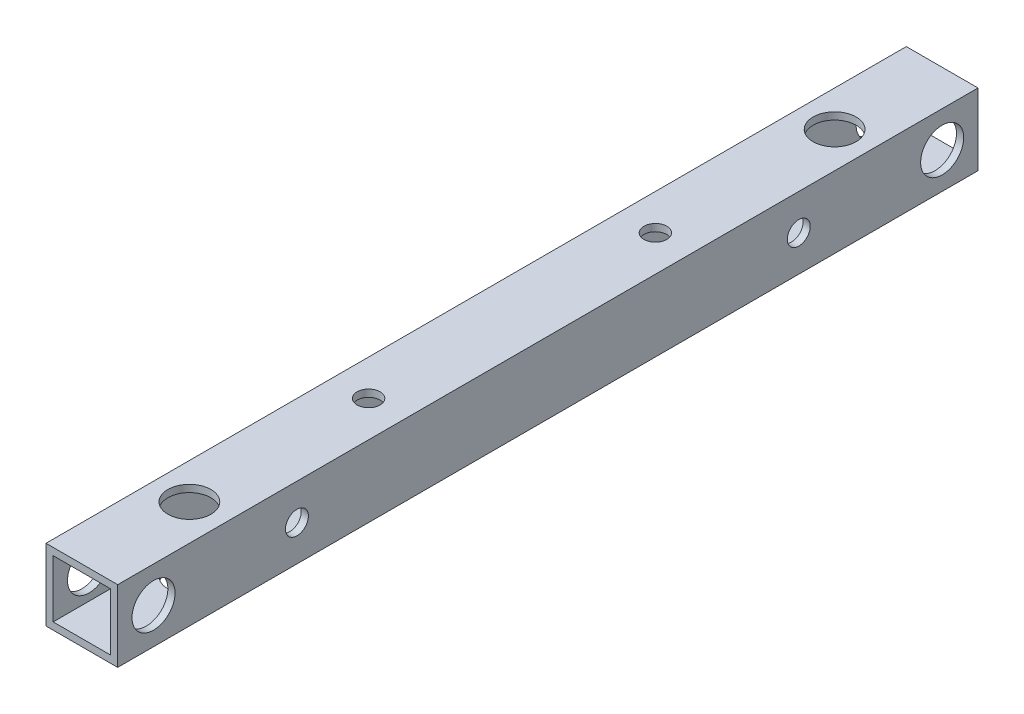
ISO-10303-21;
HEADER;
FILE_DESCRIPTION(('STEP AP214'),'2;1');
FILE_NAME('part.step','',(''),(''),'','','');
FILE_SCHEMA(('AUTOMOTIVE_DESIGN { 1 0 10303 214 1 1 1 1 }'));
ENDSEC;
DATA;
#1=APPLICATION_CONTEXT('core data for automotive mechanical design processes');
#2=APPLICATION_PROTOCOL_DEFINITION('international standard','automotive_design',2000,#1);
#3=PRODUCT_CONTEXT('',#1,'mechanical');
#4=PRODUCT('Part','Part','',(#3));
#5=PRODUCT_RELATED_PRODUCT_CATEGORY('part','',(#4));
#6=PRODUCT_DEFINITION_FORMATION('','',#4);
#7=PRODUCT_DEFINITION_CONTEXT('part definition',#1,'design');
#8=PRODUCT_DEFINITION('design','',#6,#7);
#9=PRODUCT_DEFINITION_SHAPE('','',#8);
#10=(LENGTH_UNIT() NAMED_UNIT(*) SI_UNIT(.MILLI.,.METRE.));
#11=(NAMED_UNIT(*) PLANE_ANGLE_UNIT() SI_UNIT($,.RADIAN.));
#12=(NAMED_UNIT(*) SI_UNIT($,.STERADIAN.) SOLID_ANGLE_UNIT());
#13=UNCERTAINTY_MEASURE_WITH_UNIT(LENGTH_MEASURE(1.E-05),#10,'distance_accuracy_value','');
#14=(GEOMETRIC_REPRESENTATION_CONTEXT(3) GLOBAL_UNCERTAINTY_ASSIGNED_CONTEXT((#13)) GLOBAL_UNIT_ASSIGNED_CONTEXT((#10,
#11,#12)) REPRESENTATION_CONTEXT('',''));
#15=CARTESIAN_POINT('',(0.,0.,0.));
#16=DIRECTION('',(0.,0.,1.));
#17=DIRECTION('',(1.,0.,0.));
#18=AXIS2_PLACEMENT_3D('',#15,#16,#17);
#19=CARTESIAN_POINT('',(0.,0.,120.));
#20=DIRECTION('',(0.,0.,-1.));
#21=DIRECTION('',(-1.,0.,0.));
#22=AXIS2_PLACEMENT_3D('',#19,#20,#21);
#23=PLANE('',#22);
#24=DIRECTION('',(0.,1.,0.));
#25=VECTOR('',#24,1.);
#26=CARTESIAN_POINT('',(5.,-5.,120.));
#27=LINE('',#26,#25);
#28=CARTESIAN_POINT('',(5.,-5.,120.));
#29=VERTEX_POINT('',#28);
#30=CARTESIAN_POINT('',(5.,5.,120.));
#31=VERTEX_POINT('',#30);
#32=EDGE_CURVE('E140',#29,#31,#27,.T.);
#33=ORIENTED_EDGE('',*,*,#32,.T.);
#34=DIRECTION('',(-1.,0.,0.));
#35=VECTOR('',#34,1.);
#36=CARTESIAN_POINT('',(-5.,5.,120.));
#37=LINE('',#36,#35);
#38=CARTESIAN_POINT('',(-5.,5.,120.));
#39=VERTEX_POINT('',#38);
#40=EDGE_CURVE('E143',#31,#39,#37,.T.);
#41=ORIENTED_EDGE('',*,*,#40,.T.);
#42=DIRECTION('',(0.,-1.,0.));
#43=VECTOR('',#42,1.);
#44=CARTESIAN_POINT('',(-5.,-5.,120.));
#45=LINE('',#44,#43);
#46=CARTESIAN_POINT('',(-5.,-5.,120.));
#47=VERTEX_POINT('',#46);
#48=EDGE_CURVE('E146',#39,#47,#45,.T.);
#49=ORIENTED_EDGE('',*,*,#48,.T.);
#50=DIRECTION('',(1.,0.,0.));
#51=VECTOR('',#50,1.);
#52=CARTESIAN_POINT('',(-5.,-5.,120.));
#53=LINE('',#52,#51);
#54=EDGE_CURVE('E148',#47,#29,#53,.T.);
#55=ORIENTED_EDGE('',*,*,#54,.T.);
#56=EDGE_LOOP('',(#33,#41,#49,#55));
#57=FACE_BOUND('',#56,.T.);
#58=DIRECTION('',(0.,-1.,0.));
#59=VECTOR('',#58,1.);
#60=CARTESIAN_POINT('',(-4.,-4.,120.));
#61=LINE('',#60,#59);
#62=CARTESIAN_POINT('',(-4.,4.,120.));
#63=VERTEX_POINT('',#62);
#64=CARTESIAN_POINT('',(-4.,-4.,120.));
#65=VERTEX_POINT('',#64);
#66=EDGE_CURVE('E102',#63,#65,#61,.T.);
#67=ORIENTED_EDGE('',*,*,#66,.F.);
#68=DIRECTION('',(-1.,0.,0.));
#69=VECTOR('',#68,1.);
#70=CARTESIAN_POINT('',(4.,4.,120.));
#71=LINE('',#70,#69);
#72=CARTESIAN_POINT('',(4.,4.,120.));
#73=VERTEX_POINT('',#72);
#74=EDGE_CURVE('E124',#73,#63,#71,.T.);
#75=ORIENTED_EDGE('',*,*,#74,.F.);
#76=DIRECTION('',(0.,1.,0.));
#77=VECTOR('',#76,1.);
#78=CARTESIAN_POINT('',(4.,-4.,120.));
#79=LINE('',#78,#77);
#80=CARTESIAN_POINT('',(4.,-4.,120.));
#81=VERTEX_POINT('',#80);
#82=EDGE_CURVE('E122',#81,#73,#79,.T.);
#83=ORIENTED_EDGE('',*,*,#82,.F.);
#84=DIRECTION('',(1.,0.,0.));
#85=VECTOR('',#84,1.);
#86=CARTESIAN_POINT('',(4.,-4.,120.));
#87=LINE('',#86,#85);
#88=EDGE_CURVE('E110',#65,#81,#87,.T.);
#89=ORIENTED_EDGE('',*,*,#88,.F.);
#90=EDGE_LOOP('',(#67,#75,#83,#89));
#91=FACE_BOUND('',#90,.T.);
#92=ADVANCED_FACE('F35',(#57,#91),#23,.F.);
#93=CARTESIAN_POINT('',(0.,0.,0.));
#94=DIRECTION('',(0.,0.,-1.));
#95=DIRECTION('',(-1.,0.,0.));
#96=AXIS2_PLACEMENT_3D('',#93,#94,#95);
#97=PLANE('',#96);
#98=DIRECTION('',(0.,1.,0.));
#99=VECTOR('',#98,1.);
#100=CARTESIAN_POINT('',(5.,-5.,0.));
#101=LINE('',#100,#99);
#102=CARTESIAN_POINT('',(5.,-5.,0.));
#103=VERTEX_POINT('',#102);
#104=CARTESIAN_POINT('',(5.,5.,0.));
#105=VERTEX_POINT('',#104);
#106=EDGE_CURVE('E118',#103,#105,#101,.T.);
#107=ORIENTED_EDGE('',*,*,#106,.F.);
#108=DIRECTION('',(1.,0.,0.));
#109=VECTOR('',#108,1.);
#110=CARTESIAN_POINT('',(-5.,-5.,0.));
#111=LINE('',#110,#109);
#112=CARTESIAN_POINT('',(-5.,-5.,0.));
#113=VERTEX_POINT('',#112);
#114=EDGE_CURVE('E144',#113,#103,#111,.T.);
#115=ORIENTED_EDGE('',*,*,#114,.F.);
#116=DIRECTION('',(0.,-1.,0.));
#117=VECTOR('',#116,1.);
#118=CARTESIAN_POINT('',(-5.,-5.,0.));
#119=LINE('',#118,#117);
#120=CARTESIAN_POINT('',(-5.,5.,0.));
#121=VERTEX_POINT('',#120);
#122=EDGE_CURVE('E155',#121,#113,#119,.T.);
#123=ORIENTED_EDGE('',*,*,#122,.F.);
#124=DIRECTION('',(-1.,0.,0.));
#125=VECTOR('',#124,1.);
#126=CARTESIAN_POINT('',(-5.,5.,0.));
#127=LINE('',#126,#125);
#128=EDGE_CURVE('E153',#105,#121,#127,.T.);
#129=ORIENTED_EDGE('',*,*,#128,.F.);
#130=EDGE_LOOP('',(#107,#115,#123,#129));
#131=FACE_BOUND('',#130,.T.);
#132=DIRECTION('',(-1.,0.,0.));
#133=VECTOR('',#132,1.);
#134=CARTESIAN_POINT('',(4.,4.,0.));
#135=LINE('',#134,#133);
#136=CARTESIAN_POINT('',(4.,4.,0.));
#137=VERTEX_POINT('',#136);
#138=CARTESIAN_POINT('',(-4.,4.,0.));
#139=VERTEX_POINT('',#138);
#140=EDGE_CURVE('E111',#137,#139,#135,.T.);
#141=ORIENTED_EDGE('',*,*,#140,.T.);
#142=DIRECTION('',(0.,-1.,0.));
#143=VECTOR('',#142,1.);
#144=CARTESIAN_POINT('',(-4.,-4.,0.));
#145=LINE('',#144,#143);
#146=CARTESIAN_POINT('',(-4.,-4.,0.));
#147=VERTEX_POINT('',#146);
#148=EDGE_CURVE('E60',#139,#147,#145,.T.);
#149=ORIENTED_EDGE('',*,*,#148,.T.);
#150=DIRECTION('',(1.,0.,0.));
#151=VECTOR('',#150,1.);
#152=CARTESIAN_POINT('',(4.,-4.,0.));
#153=LINE('',#152,#151);
#154=CARTESIAN_POINT('',(4.,-4.,0.));
#155=VERTEX_POINT('',#154);
#156=EDGE_CURVE('E117',#147,#155,#153,.T.);
#157=ORIENTED_EDGE('',*,*,#156,.T.);
#158=DIRECTION('',(0.,1.,0.));
#159=VECTOR('',#158,1.);
#160=CARTESIAN_POINT('',(4.,-4.,0.));
#161=LINE('',#160,#159);
#162=EDGE_CURVE('E132',#155,#137,#161,.T.);
#163=ORIENTED_EDGE('',*,*,#162,.T.);
#164=EDGE_LOOP('',(#141,#149,#157,#163));
#165=FACE_BOUND('',#164,.T.);
#166=ADVANCED_FACE('F295',(#131,#165),#97,.T.);
#167=CARTESIAN_POINT('',(5.,-5.,120.));
#168=DIRECTION('',(-1.,0.,0.));
#169=DIRECTION('',(0.,0.,1.));
#170=AXIS2_PLACEMENT_3D('',#167,#168,#169);
#171=PLANE('',#170);
#172=CARTESIAN_POINT('',(5.,0.,25.));
#173=DIRECTION('',(-1.,0.,0.));
#174=DIRECTION('',(0.,0.,1.));
#175=AXIS2_PLACEMENT_3D('',#172,#173,#174);
#176=CIRCLE('',#175,1.60000000000001);
#177=CARTESIAN_POINT('',(5.,0.,26.6));
#178=VERTEX_POINT('',#177);
#179=EDGE_CURVE('E194',#178,#178,#176,.T.);
#180=ORIENTED_EDGE('',*,*,#179,.T.);
#181=EDGE_LOOP('',(#180));
#182=FACE_BOUND('',#181,.T.);
#183=CARTESIAN_POINT('',(5.,0.,95.));
#184=DIRECTION('',(-1.,0.,0.));
#185=DIRECTION('',(0.,0.,1.));
#186=AXIS2_PLACEMENT_3D('',#183,#184,#185);
#187=CIRCLE('',#186,1.60000000000001);
#188=CARTESIAN_POINT('',(5.,0.,96.6));
#189=VERTEX_POINT('',#188);
#190=EDGE_CURVE('E218',#189,#189,#187,.T.);
#191=ORIENTED_EDGE('',*,*,#190,.T.);
#192=EDGE_LOOP('',(#191));
#193=FACE_BOUND('',#192,.T.);
#194=CARTESIAN_POINT('',(5.,0.,5.));
#195=DIRECTION('',(-1.,0.,0.));
#196=DIRECTION('',(0.,0.,1.));
#197=AXIS2_PLACEMENT_3D('',#194,#195,#196);
#198=CIRCLE('',#197,3.);
#199=CARTESIAN_POINT('',(5.,0.,8.));
#200=VERTEX_POINT('',#199);
#201=EDGE_CURVE('E169',#200,#200,#198,.T.);
#202=ORIENTED_EDGE('',*,*,#201,.T.);
#203=EDGE_LOOP('',(#202));
#204=FACE_BOUND('',#203,.T.);
#205=CARTESIAN_POINT('',(5.,0.,115.));
#206=DIRECTION('',(-1.,0.,0.));
#207=DIRECTION('',(0.,0.,1.));
#208=AXIS2_PLACEMENT_3D('',#205,#206,#207);
#209=CIRCLE('',#208,3.00000000000001);
#210=CARTESIAN_POINT('',(5.,0.,118.));
#211=VERTEX_POINT('',#210);
#212=EDGE_CURVE('E252',#211,#211,#209,.T.);
#213=ORIENTED_EDGE('',*,*,#212,.T.);
#214=EDGE_LOOP('',(#213));
#215=FACE_BOUND('',#214,.T.);
#216=ORIENTED_EDGE('',*,*,#106,.T.);
#217=DIRECTION('',(0.,0.,-1.));
#218=VECTOR('',#217,1.);
#219=CARTESIAN_POINT('',(5.,5.,120.));
#220=LINE('',#219,#218);
#221=EDGE_CURVE('E11',#31,#105,#220,.T.);
#222=ORIENTED_EDGE('',*,*,#221,.F.);
#223=ORIENTED_EDGE('',*,*,#32,.F.);
#224=DIRECTION('',(0.,0.,-1.));
#225=VECTOR('',#224,1.);
#226=CARTESIAN_POINT('',(5.,-5.,120.));
#227=LINE('',#226,#225);
#228=EDGE_CURVE('E150',#29,#103,#227,.T.);
#229=ORIENTED_EDGE('',*,*,#228,.T.);
#230=EDGE_LOOP('',(#216,#222,#223,#229));
#231=FACE_BOUND('',#230,.T.);
#232=ADVANCED_FACE('F37',(#182,#193,#204,#215,#231),#171,.F.);
#233=CARTESIAN_POINT('',(-5.,5.,120.));
#234=DIRECTION('',(0.,-1.,0.));
#235=DIRECTION('',(0.,0.,-1.));
#236=AXIS2_PLACEMENT_3D('',#233,#234,#235);
#237=PLANE('',#236);
#238=CARTESIAN_POINT('',(0.,5.,40.));
#239=DIRECTION('',(0.,1.,0.));
#240=DIRECTION('',(0.,0.,1.));
#241=AXIS2_PLACEMENT_3D('',#238,#239,#240);
#242=CIRCLE('',#241,1.6);
#243=CARTESIAN_POINT('',(0.,5.,41.6));
#244=VERTEX_POINT('',#243);
#245=EDGE_CURVE('E186',#244,#244,#242,.T.);
#246=ORIENTED_EDGE('',*,*,#245,.F.);
#247=EDGE_LOOP('',(#246));
#248=FACE_BOUND('',#247,.T.);
#249=CARTESIAN_POINT('',(0.,5.,80.));
#250=DIRECTION('',(0.,1.,0.));
#251=DIRECTION('',(0.,0.,1.));
#252=AXIS2_PLACEMENT_3D('',#249,#250,#251);
#253=CIRCLE('',#252,1.6);
#254=CARTESIAN_POINT('',(0.,5.,81.6));
#255=VERTEX_POINT('',#254);
#256=EDGE_CURVE('E227',#255,#255,#253,.T.);
#257=ORIENTED_EDGE('',*,*,#256,.F.);
#258=EDGE_LOOP('',(#257));
#259=FACE_BOUND('',#258,.T.);
#260=CARTESIAN_POINT('',(0.,5.,105.));
#261=DIRECTION('',(0.,1.,0.));
#262=DIRECTION('',(0.,0.,1.));
#263=AXIS2_PLACEMENT_3D('',#260,#261,#262);
#264=CIRCLE('',#263,3.);
#265=CARTESIAN_POINT('',(0.,5.,108.));
#266=VERTEX_POINT('',#265);
#267=EDGE_CURVE('E234',#266,#266,#264,.T.);
#268=ORIENTED_EDGE('',*,*,#267,.F.);
#269=EDGE_LOOP('',(#268));
#270=FACE_BOUND('',#269,.T.);
#271=CARTESIAN_POINT('',(0.,5.,15.));
#272=DIRECTION('',(0.,1.,0.));
#273=DIRECTION('',(0.,0.,1.));
#274=AXIS2_PLACEMENT_3D('',#271,#272,#273);
#275=CIRCLE('',#274,3.);
#276=CARTESIAN_POINT('',(0.,5.,18.));
#277=VERTEX_POINT('',#276);
#278=EDGE_CURVE('E189',#277,#277,#275,.T.);
#279=ORIENTED_EDGE('',*,*,#278,.F.);
#280=EDGE_LOOP('',(#279));
#281=FACE_BOUND('',#280,.T.);
#282=ORIENTED_EDGE('',*,*,#128,.T.);
#283=DIRECTION('',(0.,0.,-1.));
#284=VECTOR('',#283,1.);
#285=CARTESIAN_POINT('',(-5.,5.,120.));
#286=LINE('',#285,#284);
#287=EDGE_CURVE('E44',#39,#121,#286,.T.);
#288=ORIENTED_EDGE('',*,*,#287,.F.);
#289=ORIENTED_EDGE('',*,*,#40,.F.);
#290=ORIENTED_EDGE('',*,*,#221,.T.);
#291=EDGE_LOOP('',(#282,#288,#289,#290));
#292=FACE_BOUND('',#291,.T.);
#293=ADVANCED_FACE('F282',(#248,#259,#270,#281,#292),#237,.F.);
#294=CARTESIAN_POINT('',(-5.,-5.,120.));
#295=DIRECTION('',(1.,0.,0.));
#296=DIRECTION('',(0.,0.,-1.));
#297=AXIS2_PLACEMENT_3D('',#294,#295,#296);
#298=PLANE('',#297);
#299=CARTESIAN_POINT('',(-5.,0.,25.));
#300=DIRECTION('',(-1.,0.,0.));
#301=DIRECTION('',(0.,0.,1.));
#302=AXIS2_PLACEMENT_3D('',#299,#300,#301);
#303=CIRCLE('',#302,1.60000000000001);
#304=CARTESIAN_POINT('',(-5.,0.,26.6));
#305=VERTEX_POINT('',#304);
#306=EDGE_CURVE('E215',#305,#305,#303,.T.);
#307=ORIENTED_EDGE('',*,*,#306,.F.);
#308=EDGE_LOOP('',(#307));
#309=FACE_BOUND('',#308,.T.);
#310=CARTESIAN_POINT('',(-5.,0.,95.));
#311=DIRECTION('',(-1.,0.,0.));
#312=DIRECTION('',(0.,0.,1.));
#313=AXIS2_PLACEMENT_3D('',#310,#311,#312);
#314=CIRCLE('',#313,1.60000000000001);
#315=CARTESIAN_POINT('',(-5.,0.,96.6));
#316=VERTEX_POINT('',#315);
#317=EDGE_CURVE('E204',#316,#316,#314,.T.);
#318=ORIENTED_EDGE('',*,*,#317,.F.);
#319=EDGE_LOOP('',(#318));
#320=FACE_BOUND('',#319,.T.);
#321=CARTESIAN_POINT('',(-5.,0.,5.));
#322=DIRECTION('',(-1.,0.,0.));
#323=DIRECTION('',(0.,0.,1.));
#324=AXIS2_PLACEMENT_3D('',#321,#322,#323);
#325=CIRCLE('',#324,3.);
#326=CARTESIAN_POINT('',(-5.,0.,8.));
#327=VERTEX_POINT('',#326);
#328=EDGE_CURVE('E249',#327,#327,#325,.T.);
#329=ORIENTED_EDGE('',*,*,#328,.F.);
#330=EDGE_LOOP('',(#329));
#331=FACE_BOUND('',#330,.T.);
#332=CARTESIAN_POINT('',(-5.,0.,115.));
#333=DIRECTION('',(-1.,0.,0.));
#334=DIRECTION('',(0.,0.,1.));
#335=AXIS2_PLACEMENT_3D('',#332,#333,#334);
#336=CIRCLE('',#335,3.00000000000001);
#337=CARTESIAN_POINT('',(-5.,0.,118.));
#338=VERTEX_POINT('',#337);
#339=EDGE_CURVE('E246',#338,#338,#336,.T.);
#340=ORIENTED_EDGE('',*,*,#339,.F.);
#341=EDGE_LOOP('',(#340));
#342=FACE_BOUND('',#341,.T.);
#343=ORIENTED_EDGE('',*,*,#122,.T.);
#344=DIRECTION('',(0.,0.,-1.));
#345=VECTOR('',#344,1.);
#346=CARTESIAN_POINT('',(-5.,-5.,120.));
#347=LINE('',#346,#345);
#348=EDGE_CURVE('E160',#47,#113,#347,.T.);
#349=ORIENTED_EDGE('',*,*,#348,.F.);
#350=ORIENTED_EDGE('',*,*,#48,.F.);
#351=ORIENTED_EDGE('',*,*,#287,.T.);
#352=EDGE_LOOP('',(#343,#349,#350,#351));
#353=FACE_BOUND('',#352,.T.);
#354=ADVANCED_FACE('F279',(#309,#320,#331,#342,#353),#298,.F.);
#355=CARTESIAN_POINT('',(-5.,-5.,120.));
#356=DIRECTION('',(0.,1.,0.));
#357=DIRECTION('',(0.,0.,1.));
#358=AXIS2_PLACEMENT_3D('',#355,#356,#357);
#359=PLANE('',#358);
#360=CARTESIAN_POINT('',(0.,-5.,40.));
#361=DIRECTION('',(0.,-1.,0.));
#362=DIRECTION('',(0.,0.,-1.));
#363=AXIS2_PLACEMENT_3D('',#360,#361,#362);
#364=CIRCLE('',#363,3.);
#365=CARTESIAN_POINT('',(0.,-5.,37.));
#366=VERTEX_POINT('',#365);
#367=EDGE_CURVE('E200',#366,#366,#364,.T.);
#368=ORIENTED_EDGE('',*,*,#367,.F.);
#369=EDGE_LOOP('',(#368));
#370=FACE_BOUND('',#369,.T.);
#371=CARTESIAN_POINT('',(0.,-5.,80.));
#372=DIRECTION('',(0.,-1.,0.));
#373=DIRECTION('',(0.,0.,-1.));
#374=AXIS2_PLACEMENT_3D('',#371,#372,#373);
#375=CIRCLE('',#374,3.);
#376=CARTESIAN_POINT('',(0.,-5.,77.));
#377=VERTEX_POINT('',#376);
#378=EDGE_CURVE('E206',#377,#377,#375,.T.);
#379=ORIENTED_EDGE('',*,*,#378,.F.);
#380=EDGE_LOOP('',(#379));
#381=FACE_BOUND('',#380,.T.);
#382=CARTESIAN_POINT('',(0.,-5.,105.));
#383=DIRECTION('',(0.,1.,0.));
#384=DIRECTION('',(0.,0.,1.));
#385=AXIS2_PLACEMENT_3D('',#382,#383,#384);
#386=CIRCLE('',#385,3.);
#387=CARTESIAN_POINT('',(0.,-5.,108.));
#388=VERTEX_POINT('',#387);
#389=EDGE_CURVE('E177',#388,#388,#386,.T.);
#390=ORIENTED_EDGE('',*,*,#389,.T.);
#391=EDGE_LOOP('',(#390));
#392=FACE_BOUND('',#391,.T.);
#393=CARTESIAN_POINT('',(0.,-5.,15.));
#394=DIRECTION('',(0.,1.,0.));
#395=DIRECTION('',(0.,0.,1.));
#396=AXIS2_PLACEMENT_3D('',#393,#394,#395);
#397=CIRCLE('',#396,3.);
#398=CARTESIAN_POINT('',(0.,-5.,18.));
#399=VERTEX_POINT('',#398);
#400=EDGE_CURVE('E237',#399,#399,#397,.T.);
#401=ORIENTED_EDGE('',*,*,#400,.T.);
#402=EDGE_LOOP('',(#401));
#403=FACE_BOUND('',#402,.T.);
#404=ORIENTED_EDGE('',*,*,#114,.T.);
#405=ORIENTED_EDGE('',*,*,#228,.F.);
#406=ORIENTED_EDGE('',*,*,#54,.F.);
#407=ORIENTED_EDGE('',*,*,#348,.T.);
#408=EDGE_LOOP('',(#404,#405,#406,#407));
#409=FACE_BOUND('',#408,.T.);
#410=ADVANCED_FACE('F266',(#370,#381,#392,#403,#409),#359,.F.);
#411=CARTESIAN_POINT('',(-4.,-4.,120.));
#412=DIRECTION('',(1.,0.,0.));
#413=DIRECTION('',(0.,1.,0.));
#414=AXIS2_PLACEMENT_3D('',#411,#412,#413);
#415=PLANE('',#414);
#416=CARTESIAN_POINT('',(-4.,0.,25.));
#417=DIRECTION('',(1.,0.,0.));
#418=DIRECTION('',(0.,1.,0.));
#419=AXIS2_PLACEMENT_3D('',#416,#417,#418);
#420=CIRCLE('',#419,1.60000000000001);
#421=CARTESIAN_POINT('',(-4.,1.60000000000001,25.));
#422=VERTEX_POINT('',#421);
#423=EDGE_CURVE('E197',#422,#422,#420,.T.);
#424=ORIENTED_EDGE('',*,*,#423,.F.);
#425=EDGE_LOOP('',(#424));
#426=FACE_BOUND('',#425,.T.);
#427=CARTESIAN_POINT('',(-4.,0.,95.));
#428=DIRECTION('',(1.,0.,0.));
#429=DIRECTION('',(0.,1.,0.));
#430=AXIS2_PLACEMENT_3D('',#427,#428,#429);
#431=CIRCLE('',#430,1.60000000000001);
#432=CARTESIAN_POINT('',(-4.,1.60000000000001,95.));
#433=VERTEX_POINT('',#432);
#434=EDGE_CURVE('E193',#433,#433,#431,.T.);
#435=ORIENTED_EDGE('',*,*,#434,.F.);
#436=EDGE_LOOP('',(#435));
#437=FACE_BOUND('',#436,.T.);
#438=CARTESIAN_POINT('',(-4.,0.,5.));
#439=DIRECTION('',(1.,0.,0.));
#440=DIRECTION('',(0.,1.,0.));
#441=AXIS2_PLACEMENT_3D('',#438,#439,#440);
#442=CIRCLE('',#441,3.);
#443=CARTESIAN_POINT('',(-4.,3.,5.));
#444=VERTEX_POINT('',#443);
#445=EDGE_CURVE('E130',#444,#444,#442,.T.);
#446=ORIENTED_EDGE('',*,*,#445,.F.);
#447=EDGE_LOOP('',(#446));
#448=FACE_BOUND('',#447,.T.);
#449=CARTESIAN_POINT('',(-4.,0.,115.));
#450=DIRECTION('',(1.,0.,0.));
#451=DIRECTION('',(0.,1.,0.));
#452=AXIS2_PLACEMENT_3D('',#449,#450,#451);
#453=CIRCLE('',#452,3.00000000000001);
#454=CARTESIAN_POINT('',(-4.,3.00000000000001,115.));
#455=VERTEX_POINT('',#454);
#456=EDGE_CURVE('E168',#455,#455,#453,.T.);
#457=ORIENTED_EDGE('',*,*,#456,.F.);
#458=EDGE_LOOP('',(#457));
#459=FACE_BOUND('',#458,.T.);
#460=ORIENTED_EDGE('',*,*,#148,.F.);
#461=DIRECTION('',(0.,0.,-1.));
#462=VECTOR('',#461,1.);
#463=CARTESIAN_POINT('',(-4.,4.,120.));
#464=LINE('',#463,#462);
#465=EDGE_CURVE('E106',#63,#139,#464,.T.);
#466=ORIENTED_EDGE('',*,*,#465,.F.);
#467=ORIENTED_EDGE('',*,*,#66,.T.);
#468=DIRECTION('',(0.,0.,-1.));
#469=VECTOR('',#468,1.);
#470=CARTESIAN_POINT('',(-4.,-4.,120.));
#471=LINE('',#470,#469);
#472=EDGE_CURVE('E105',#65,#147,#471,.T.);
#473=ORIENTED_EDGE('',*,*,#472,.T.);
#474=EDGE_LOOP('',(#460,#466,#467,#473));
#475=FACE_BOUND('',#474,.T.);
#476=ADVANCED_FACE('F104',(#426,#437,#448,#459,#475),#415,.T.);
#477=CARTESIAN_POINT('',(4.,-4.,120.));
#478=DIRECTION('',(0.,1.,0.));
#479=DIRECTION('',(-1.,0.,0.));
#480=AXIS2_PLACEMENT_3D('',#477,#478,#479);
#481=PLANE('',#480);
#482=CARTESIAN_POINT('',(0.,-4.,40.));
#483=DIRECTION('',(0.,1.,0.));
#484=DIRECTION('',(-1.,0.,0.));
#485=AXIS2_PLACEMENT_3D('',#482,#483,#484);
#486=CIRCLE('',#485,3.);
#487=CARTESIAN_POINT('',(-3.,-4.,40.));
#488=VERTEX_POINT('',#487);
#489=EDGE_CURVE('E39',#488,#488,#486,.T.);
#490=ORIENTED_EDGE('',*,*,#489,.F.);
#491=EDGE_LOOP('',(#490));
#492=FACE_BOUND('',#491,.T.);
#493=CARTESIAN_POINT('',(0.,-4.,80.));
#494=DIRECTION('',(0.,1.,0.));
#495=DIRECTION('',(-1.,0.,0.));
#496=AXIS2_PLACEMENT_3D('',#493,#494,#495);
#497=CIRCLE('',#496,3.);
#498=CARTESIAN_POINT('',(-3.,-4.,80.));
#499=VERTEX_POINT('',#498);
#500=EDGE_CURVE('E198',#499,#499,#497,.T.);
#501=ORIENTED_EDGE('',*,*,#500,.F.);
#502=EDGE_LOOP('',(#501));
#503=FACE_BOUND('',#502,.T.);
#504=CARTESIAN_POINT('',(0.,-4.,105.));
#505=DIRECTION('',(0.,1.,0.));
#506=DIRECTION('',(-1.,0.,0.));
#507=AXIS2_PLACEMENT_3D('',#504,#505,#506);
#508=CIRCLE('',#507,3.);
#509=CARTESIAN_POINT('',(-3.,-4.,105.));
#510=VERTEX_POINT('',#509);
#511=EDGE_CURVE('E181',#510,#510,#508,.T.);
#512=ORIENTED_EDGE('',*,*,#511,.F.);
#513=EDGE_LOOP('',(#512));
#514=FACE_BOUND('',#513,.T.);
#515=CARTESIAN_POINT('',(0.,-4.,15.));
#516=DIRECTION('',(0.,1.,0.));
#517=DIRECTION('',(-1.,0.,0.));
#518=AXIS2_PLACEMENT_3D('',#515,#516,#517);
#519=CIRCLE('',#518,3.);
#520=CARTESIAN_POINT('',(-3.,-4.,15.));
#521=VERTEX_POINT('',#520);
#522=EDGE_CURVE('E176',#521,#521,#519,.T.);
#523=ORIENTED_EDGE('',*,*,#522,.F.);
#524=EDGE_LOOP('',(#523));
#525=FACE_BOUND('',#524,.T.);
#526=ORIENTED_EDGE('',*,*,#156,.F.);
#527=ORIENTED_EDGE('',*,*,#472,.F.);
#528=ORIENTED_EDGE('',*,*,#88,.T.);
#529=DIRECTION('',(0.,0.,-1.));
#530=VECTOR('',#529,1.);
#531=CARTESIAN_POINT('',(4.,-4.,120.));
#532=LINE('',#531,#530);
#533=EDGE_CURVE('E119',#81,#155,#532,.T.);
#534=ORIENTED_EDGE('',*,*,#533,.T.);
#535=EDGE_LOOP('',(#526,#527,#528,#534));
#536=FACE_BOUND('',#535,.T.);
#537=ADVANCED_FACE('F114',(#492,#503,#514,#525,#536),#481,.T.);
#538=CARTESIAN_POINT('',(4.,-4.,120.));
#539=DIRECTION('',(-1.,0.,0.));
#540=DIRECTION('',(0.,0.,1.));
#541=AXIS2_PLACEMENT_3D('',#538,#539,#540);
#542=PLANE('',#541);
#543=CARTESIAN_POINT('',(4.,0.,25.));
#544=DIRECTION('',(-1.,0.,0.));
#545=DIRECTION('',(0.,0.,1.));
#546=AXIS2_PLACEMENT_3D('',#543,#544,#545);
#547=CIRCLE('',#546,1.60000000000001);
#548=CARTESIAN_POINT('',(4.,0.,26.6));
#549=VERTEX_POINT('',#548);
#550=EDGE_CURVE('E195',#549,#549,#547,.T.);
#551=ORIENTED_EDGE('',*,*,#550,.F.);
#552=EDGE_LOOP('',(#551));
#553=FACE_BOUND('',#552,.T.);
#554=CARTESIAN_POINT('',(4.,0.,95.));
#555=DIRECTION('',(-1.,0.,0.));
#556=DIRECTION('',(0.,0.,1.));
#557=AXIS2_PLACEMENT_3D('',#554,#555,#556);
#558=CIRCLE('',#557,1.60000000000001);
#559=CARTESIAN_POINT('',(4.,0.,96.6));
#560=VERTEX_POINT('',#559);
#561=EDGE_CURVE('E190',#560,#560,#558,.T.);
#562=ORIENTED_EDGE('',*,*,#561,.F.);
#563=EDGE_LOOP('',(#562));
#564=FACE_BOUND('',#563,.T.);
#565=CARTESIAN_POINT('',(4.,0.,5.));
#566=DIRECTION('',(-1.,0.,0.));
#567=DIRECTION('',(0.,0.,1.));
#568=AXIS2_PLACEMENT_3D('',#565,#566,#567);
#569=CIRCLE('',#568,3.);
#570=CARTESIAN_POINT('',(4.,0.,8.));
#571=VERTEX_POINT('',#570);
#572=EDGE_CURVE('E170',#571,#571,#569,.T.);
#573=ORIENTED_EDGE('',*,*,#572,.F.);
#574=EDGE_LOOP('',(#573));
#575=FACE_BOUND('',#574,.T.);
#576=CARTESIAN_POINT('',(4.,0.,115.));
#577=DIRECTION('',(-1.,0.,0.));
#578=DIRECTION('',(0.,0.,1.));
#579=AXIS2_PLACEMENT_3D('',#576,#577,#578);
#580=CIRCLE('',#579,3.00000000000001);
#581=CARTESIAN_POINT('',(4.,0.,118.));
#582=VERTEX_POINT('',#581);
#583=EDGE_CURVE('E165',#582,#582,#580,.T.);
#584=ORIENTED_EDGE('',*,*,#583,.F.);
#585=EDGE_LOOP('',(#584));
#586=FACE_BOUND('',#585,.T.);
#587=ORIENTED_EDGE('',*,*,#162,.F.);
#588=ORIENTED_EDGE('',*,*,#533,.F.);
#589=ORIENTED_EDGE('',*,*,#82,.T.);
#590=DIRECTION('',(0.,0.,-1.));
#591=VECTOR('',#590,1.);
#592=CARTESIAN_POINT('',(4.,4.,120.));
#593=LINE('',#592,#591);
#594=EDGE_CURVE('E52',#73,#137,#593,.T.);
#595=ORIENTED_EDGE('',*,*,#594,.T.);
#596=EDGE_LOOP('',(#587,#588,#589,#595));
#597=FACE_BOUND('',#596,.T.);
#598=ADVANCED_FACE('F357',(#553,#564,#575,#586,#597),#542,.T.);
#599=CARTESIAN_POINT('',(4.,4.,120.));
#600=DIRECTION('',(0.,-1.,0.));
#601=DIRECTION('',(1.,0.,0.));
#602=AXIS2_PLACEMENT_3D('',#599,#600,#601);
#603=PLANE('',#602);
#604=CARTESIAN_POINT('',(0.,4.,40.));
#605=DIRECTION('',(0.,-1.,0.));
#606=DIRECTION('',(1.,0.,0.));
#607=AXIS2_PLACEMENT_3D('',#604,#605,#606);
#608=CIRCLE('',#607,1.6);
#609=CARTESIAN_POINT('',(1.6,4.,40.));
#610=VERTEX_POINT('',#609);
#611=EDGE_CURVE('E185',#610,#610,#608,.T.);
#612=ORIENTED_EDGE('',*,*,#611,.F.);
#613=EDGE_LOOP('',(#612));
#614=FACE_BOUND('',#613,.T.);
#615=CARTESIAN_POINT('',(0.,4.,80.));
#616=DIRECTION('',(0.,-1.,0.));
#617=DIRECTION('',(1.,0.,0.));
#618=AXIS2_PLACEMENT_3D('',#615,#616,#617);
#619=CIRCLE('',#618,1.6);
#620=CARTESIAN_POINT('',(1.6,4.,80.));
#621=VERTEX_POINT('',#620);
#622=EDGE_CURVE('E182',#621,#621,#619,.T.);
#623=ORIENTED_EDGE('',*,*,#622,.F.);
#624=EDGE_LOOP('',(#623));
#625=FACE_BOUND('',#624,.T.);
#626=CARTESIAN_POINT('',(0.,4.,105.));
#627=DIRECTION('',(0.,-1.,0.));
#628=DIRECTION('',(1.,0.,0.));
#629=AXIS2_PLACEMENT_3D('',#626,#627,#628);
#630=CIRCLE('',#629,3.);
#631=CARTESIAN_POINT('',(3.,4.,105.));
#632=VERTEX_POINT('',#631);
#633=EDGE_CURVE('E178',#632,#632,#630,.T.);
#634=ORIENTED_EDGE('',*,*,#633,.F.);
#635=EDGE_LOOP('',(#634));
#636=FACE_BOUND('',#635,.T.);
#637=CARTESIAN_POINT('',(0.,4.,15.));
#638=DIRECTION('',(0.,-1.,0.));
#639=DIRECTION('',(1.,0.,0.));
#640=AXIS2_PLACEMENT_3D('',#637,#638,#639);
#641=CIRCLE('',#640,3.);
#642=CARTESIAN_POINT('',(3.,4.,15.));
#643=VERTEX_POINT('',#642);
#644=EDGE_CURVE('E173',#643,#643,#641,.T.);
#645=ORIENTED_EDGE('',*,*,#644,.F.);
#646=EDGE_LOOP('',(#645));
#647=FACE_BOUND('',#646,.T.);
#648=ORIENTED_EDGE('',*,*,#140,.F.);
#649=ORIENTED_EDGE('',*,*,#594,.F.);
#650=ORIENTED_EDGE('',*,*,#74,.T.);
#651=ORIENTED_EDGE('',*,*,#465,.T.);
#652=EDGE_LOOP('',(#648,#649,#650,#651));
#653=FACE_BOUND('',#652,.T.);
#654=ADVANCED_FACE('F355',(#614,#625,#636,#647,#653),#603,.T.);
#655=CARTESIAN_POINT('',(5.,0.,115.));
#656=DIRECTION('',(-1.,0.,0.));
#657=DIRECTION('',(0.,0.,1.));
#658=AXIS2_PLACEMENT_3D('',#655,#656,#657);
#659=CYLINDRICAL_SURFACE('',#658,3.00000000000001);
#660=ORIENTED_EDGE('',*,*,#583,.T.);
#661=EDGE_LOOP('',(#660));
#662=FACE_BOUND('',#661,.T.);
#663=ORIENTED_EDGE('',*,*,#212,.F.);
#664=EDGE_LOOP('',(#663));
#665=FACE_BOUND('',#664,.T.);
#666=ADVANCED_FACE('F276',(#662,#665),#659,.F.);
#667=CARTESIAN_POINT('',(5.,0.,5.));
#668=DIRECTION('',(-1.,0.,0.));
#669=DIRECTION('',(0.,0.,1.));
#670=AXIS2_PLACEMENT_3D('',#667,#668,#669);
#671=CYLINDRICAL_SURFACE('',#670,3.);
#672=ORIENTED_EDGE('',*,*,#572,.T.);
#673=EDGE_LOOP('',(#672));
#674=FACE_BOUND('',#673,.T.);
#675=ORIENTED_EDGE('',*,*,#201,.F.);
#676=EDGE_LOOP('',(#675));
#677=FACE_BOUND('',#676,.T.);
#678=ADVANCED_FACE('F274',(#674,#677),#671,.F.);
#679=ORIENTED_EDGE('',*,*,#456,.T.);
#680=EDGE_LOOP('',(#679));
#681=FACE_BOUND('',#680,.T.);
#682=ORIENTED_EDGE('',*,*,#339,.T.);
#683=EDGE_LOOP('',(#682));
#684=FACE_BOUND('',#683,.T.);
#685=ADVANCED_FACE('F271',(#681,#684),#659,.F.);
#686=ORIENTED_EDGE('',*,*,#445,.T.);
#687=EDGE_LOOP('',(#686));
#688=FACE_BOUND('',#687,.T.);
#689=ORIENTED_EDGE('',*,*,#328,.T.);
#690=EDGE_LOOP('',(#689));
#691=FACE_BOUND('',#690,.T.);
#692=ADVANCED_FACE('F261',(#688,#691),#671,.F.);
#693=CARTESIAN_POINT('',(0.,-5.,15.));
#694=DIRECTION('',(0.,1.,0.));
#695=DIRECTION('',(0.,0.,1.));
#696=AXIS2_PLACEMENT_3D('',#693,#694,#695);
#697=CYLINDRICAL_SURFACE('',#696,3.);
#698=ORIENTED_EDGE('',*,*,#644,.T.);
#699=EDGE_LOOP('',(#698));
#700=FACE_BOUND('',#699,.T.);
#701=ORIENTED_EDGE('',*,*,#278,.T.);
#702=EDGE_LOOP('',(#701));
#703=FACE_BOUND('',#702,.T.);
#704=ADVANCED_FACE('F335',(#700,#703),#697,.F.);
#705=CARTESIAN_POINT('',(0.,-5.,105.));
#706=DIRECTION('',(0.,1.,0.));
#707=DIRECTION('',(0.,0.,1.));
#708=AXIS2_PLACEMENT_3D('',#705,#706,#707);
#709=CYLINDRICAL_SURFACE('',#708,3.);
#710=ORIENTED_EDGE('',*,*,#633,.T.);
#711=EDGE_LOOP('',(#710));
#712=FACE_BOUND('',#711,.T.);
#713=ORIENTED_EDGE('',*,*,#267,.T.);
#714=EDGE_LOOP('',(#713));
#715=FACE_BOUND('',#714,.T.);
#716=ADVANCED_FACE('F332',(#712,#715),#709,.F.);
#717=ORIENTED_EDGE('',*,*,#522,.T.);
#718=EDGE_LOOP('',(#717));
#719=FACE_BOUND('',#718,.T.);
#720=ORIENTED_EDGE('',*,*,#400,.F.);
#721=EDGE_LOOP('',(#720));
#722=FACE_BOUND('',#721,.T.);
#723=ADVANCED_FACE('F329',(#719,#722),#697,.F.);
#724=ORIENTED_EDGE('',*,*,#511,.T.);
#725=EDGE_LOOP('',(#724));
#726=FACE_BOUND('',#725,.T.);
#727=ORIENTED_EDGE('',*,*,#389,.F.);
#728=EDGE_LOOP('',(#727));
#729=FACE_BOUND('',#728,.T.);
#730=ADVANCED_FACE('F331',(#726,#729),#709,.F.);
#731=CARTESIAN_POINT('',(0.,-5.,80.));
#732=DIRECTION('',(0.,1.,0.));
#733=DIRECTION('',(0.,0.,1.));
#734=AXIS2_PLACEMENT_3D('',#731,#732,#733);
#735=CYLINDRICAL_SURFACE('',#734,1.6);
#736=ORIENTED_EDGE('',*,*,#622,.T.);
#737=EDGE_LOOP('',(#736));
#738=FACE_BOUND('',#737,.T.);
#739=ORIENTED_EDGE('',*,*,#256,.T.);
#740=EDGE_LOOP('',(#739));
#741=FACE_BOUND('',#740,.T.);
#742=ADVANCED_FACE('F340',(#738,#741),#735,.F.);
#743=CARTESIAN_POINT('',(0.,-5.,40.));
#744=DIRECTION('',(0.,1.,0.));
#745=DIRECTION('',(0.,0.,1.));
#746=AXIS2_PLACEMENT_3D('',#743,#744,#745);
#747=CYLINDRICAL_SURFACE('',#746,1.6);
#748=ORIENTED_EDGE('',*,*,#611,.T.);
#749=EDGE_LOOP('',(#748));
#750=FACE_BOUND('',#749,.T.);
#751=ORIENTED_EDGE('',*,*,#245,.T.);
#752=EDGE_LOOP('',(#751));
#753=FACE_BOUND('',#752,.T.);
#754=ADVANCED_FACE('F440',(#750,#753),#747,.F.);
#755=CARTESIAN_POINT('',(5.,0.,95.));
#756=DIRECTION('',(-1.,0.,0.));
#757=DIRECTION('',(0.,0.,1.));
#758=AXIS2_PLACEMENT_3D('',#755,#756,#757);
#759=CYLINDRICAL_SURFACE('',#758,1.60000000000001);
#760=ORIENTED_EDGE('',*,*,#561,.T.);
#761=EDGE_LOOP('',(#760));
#762=FACE_BOUND('',#761,.T.);
#763=ORIENTED_EDGE('',*,*,#190,.F.);
#764=EDGE_LOOP('',(#763));
#765=FACE_BOUND('',#764,.T.);
#766=ADVANCED_FACE('F450',(#762,#765),#759,.F.);
#767=CARTESIAN_POINT('',(5.,0.,25.));
#768=DIRECTION('',(-1.,0.,0.));
#769=DIRECTION('',(0.,0.,1.));
#770=AXIS2_PLACEMENT_3D('',#767,#768,#769);
#771=CYLINDRICAL_SURFACE('',#770,1.60000000000001);
#772=ORIENTED_EDGE('',*,*,#550,.T.);
#773=EDGE_LOOP('',(#772));
#774=FACE_BOUND('',#773,.T.);
#775=ORIENTED_EDGE('',*,*,#179,.F.);
#776=EDGE_LOOP('',(#775));
#777=FACE_BOUND('',#776,.T.);
#778=ADVANCED_FACE('F482',(#774,#777),#771,.F.);
#779=ORIENTED_EDGE('',*,*,#434,.T.);
#780=EDGE_LOOP('',(#779));
#781=FACE_BOUND('',#780,.T.);
#782=ORIENTED_EDGE('',*,*,#317,.T.);
#783=EDGE_LOOP('',(#782));
#784=FACE_BOUND('',#783,.T.);
#785=ADVANCED_FACE('F485',(#781,#784),#759,.F.);
#786=ORIENTED_EDGE('',*,*,#423,.T.);
#787=EDGE_LOOP('',(#786));
#788=FACE_BOUND('',#787,.T.);
#789=ORIENTED_EDGE('',*,*,#306,.T.);
#790=EDGE_LOOP('',(#789));
#791=FACE_BOUND('',#790,.T.);
#792=ADVANCED_FACE('F495',(#788,#791),#771,.F.);
#793=CARTESIAN_POINT('',(0.,-3.,80.));
#794=DIRECTION('',(0.,-1.,0.));
#795=DIRECTION('',(0.,0.,-1.));
#796=AXIS2_PLACEMENT_3D('',#793,#794,#795);
#797=CYLINDRICAL_SURFACE('',#796,3.);
#798=ORIENTED_EDGE('',*,*,#500,.T.);
#799=EDGE_LOOP('',(#798));
#800=FACE_BOUND('',#799,.T.);
#801=ORIENTED_EDGE('',*,*,#378,.T.);
#802=EDGE_LOOP('',(#801));
#803=FACE_BOUND('',#802,.T.);
#804=ADVANCED_FACE('F510',(#800,#803),#797,.F.);
#805=CARTESIAN_POINT('',(0.,-3.,40.));
#806=DIRECTION('',(0.,-1.,0.));
#807=DIRECTION('',(0.,0.,-1.));
#808=AXIS2_PLACEMENT_3D('',#805,#806,#807);
#809=CYLINDRICAL_SURFACE('',#808,3.);
#810=ORIENTED_EDGE('',*,*,#489,.T.);
#811=EDGE_LOOP('',(#810));
#812=FACE_BOUND('',#811,.T.);
#813=ORIENTED_EDGE('',*,*,#367,.T.);
#814=EDGE_LOOP('',(#813));
#815=FACE_BOUND('',#814,.T.);
#816=ADVANCED_FACE('F528',(#812,#815),#809,.F.);
#817=CLOSED_SHELL('',(#92,#166,#232,#293,#354,#410,#476,#537,#598,#654,#666,#678,#685,#692,#704,
#716,#723,#730,#742,#754,#766,#778,#785,#792,#804,#816));
#818=MANIFOLD_SOLID_BREP('B2',#817);
#819=ADVANCED_BREP_SHAPE_REPRESENTATION('',(#18,#818),#14);
#820=SHAPE_DEFINITION_REPRESENTATION(#9,#819);
ENDSEC;
END-ISO-10303-21;
